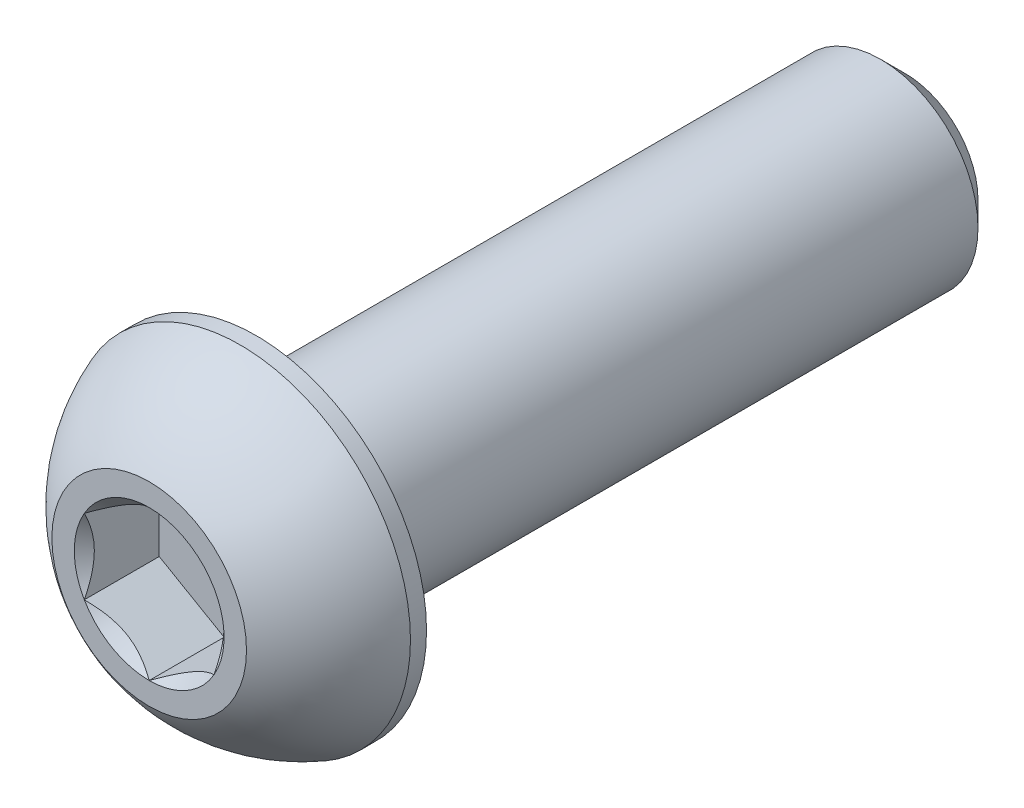
ISO-10303-21;
HEADER;
FILE_DESCRIPTION(('STEP AP214'),'2;1');
FILE_NAME('part.step','',(''),(''),'','','');
FILE_SCHEMA(('AUTOMOTIVE_DESIGN { 1 0 10303 214 1 1 1 1 }'));
ENDSEC;
DATA;
#1=APPLICATION_CONTEXT('core data for automotive mechanical design processes');
#2=APPLICATION_PROTOCOL_DEFINITION('international standard','automotive_design',2000,#1);
#3=PRODUCT_CONTEXT('',#1,'mechanical');
#4=PRODUCT('Part','Part','',(#3));
#5=PRODUCT_RELATED_PRODUCT_CATEGORY('part','',(#4));
#6=PRODUCT_DEFINITION_FORMATION('','',#4);
#7=PRODUCT_DEFINITION_CONTEXT('part definition',#1,'design');
#8=PRODUCT_DEFINITION('design','',#6,#7);
#9=PRODUCT_DEFINITION_SHAPE('','',#8);
#10=(LENGTH_UNIT() NAMED_UNIT(*) SI_UNIT(.MILLI.,.METRE.));
#11=(NAMED_UNIT(*) PLANE_ANGLE_UNIT() SI_UNIT($,.RADIAN.));
#12=(NAMED_UNIT(*) SI_UNIT($,.STERADIAN.) SOLID_ANGLE_UNIT());
#13=UNCERTAINTY_MEASURE_WITH_UNIT(LENGTH_MEASURE(1.E-05),#10,'distance_accuracy_value','');
#14=(GEOMETRIC_REPRESENTATION_CONTEXT(3) GLOBAL_UNCERTAINTY_ASSIGNED_CONTEXT((#13)) GLOBAL_UNIT_ASSIGNED_CONTEXT((#10,
#11,#12)) REPRESENTATION_CONTEXT('',''));
#15=CARTESIAN_POINT('',(0.,0.,0.));
#16=DIRECTION('',(0.,0.,1.));
#17=DIRECTION('',(1.,0.,0.));
#18=AXIS2_PLACEMENT_3D('',#15,#16,#17);
#19=CARTESIAN_POINT('',(0.,0.,-23.3));
#20=DIRECTION('',(0.,0.,1.));
#21=DIRECTION('',(1.,0.,0.));
#22=AXIS2_PLACEMENT_3D('',#19,#20,#21);
#23=PLANE('',#22);
#24=CARTESIAN_POINT('',(0.,0.,-23.3));
#25=DIRECTION('',(0.,0.,1.));
#26=DIRECTION('',(1.,0.,0.));
#27=AXIS2_PLACEMENT_3D('',#24,#25,#26);
#28=CIRCLE('',#27,2.25000000000002);
#29=CARTESIAN_POINT('',(2.25000000000002,0.,-23.3));
#30=VERTEX_POINT('',#29);
#31=EDGE_CURVE('E45',#30,#30,#28,.T.);
#32=ORIENTED_EDGE('',*,*,#31,.F.);
#33=EDGE_LOOP('',(#32));
#34=FACE_BOUND('',#33,.T.);
#35=ADVANCED_FACE('F42',(#34),#23,.F.);
#36=CARTESIAN_POINT('',(0.,0.,-23.3));
#37=DIRECTION('',(0.,0.,1.));
#38=DIRECTION('',(1.,0.,0.));
#39=AXIS2_PLACEMENT_3D('',#36,#37,#38);
#40=CONICAL_SURFACE('',#39,2.25000000000002,0.785398163397447);
#41=CARTESIAN_POINT('',(0.,0.,-22.55));
#42=DIRECTION('',(0.,0.,1.));
#43=DIRECTION('',(1.,0.,0.));
#44=AXIS2_PLACEMENT_3D('',#41,#42,#43);
#45=CIRCLE('',#44,3.00000000000002);
#46=CARTESIAN_POINT('',(3.00000000000002,0.,-22.55));
#47=VERTEX_POINT('',#46);
#48=EDGE_CURVE('E138',#47,#47,#45,.T.);
#49=ORIENTED_EDGE('',*,*,#48,.F.);
#50=EDGE_LOOP('',(#49));
#51=FACE_BOUND('',#50,.T.);
#52=ORIENTED_EDGE('',*,*,#31,.T.);
#53=EDGE_LOOP('',(#52));
#54=FACE_BOUND('',#53,.T.);
#55=ADVANCED_FACE('F159',(#51,#54),#40,.T.);
#56=CARTESIAN_POINT('',(0.,0.,0.));
#57=DIRECTION('',(0.,0.,1.));
#58=DIRECTION('',(1.,0.,0.));
#59=AXIS2_PLACEMENT_3D('',#56,#57,#58);
#60=CYLINDRICAL_SURFACE('',#59,3.00000000000001);
#61=CARTESIAN_POINT('',(0.,0.,-3.3));
#62=DIRECTION('',(0.,0.,1.));
#63=DIRECTION('',(1.,0.,0.));
#64=AXIS2_PLACEMENT_3D('',#61,#62,#63);
#65=CIRCLE('',#64,3.00000000000001);
#66=CARTESIAN_POINT('',(3.00000000000001,0.,-3.3));
#67=VERTEX_POINT('',#66);
#68=EDGE_CURVE('E12',#67,#67,#65,.T.);
#69=ORIENTED_EDGE('',*,*,#68,.F.);
#70=EDGE_LOOP('',(#69));
#71=FACE_BOUND('',#70,.T.);
#72=ORIENTED_EDGE('',*,*,#48,.T.);
#73=EDGE_LOOP('',(#72));
#74=FACE_BOUND('',#73,.T.);
#75=ADVANCED_FACE('F166',(#71,#74),#60,.T.);
#76=CARTESIAN_POINT('',(5.25,0.,-3.3));
#77=DIRECTION('',(0.,0.,-1.));
#78=DIRECTION('',(-1.,0.,0.));
#79=AXIS2_PLACEMENT_3D('',#76,#77,#78);
#80=PLANE('',#79);
#81=ORIENTED_EDGE('',*,*,#68,.T.);
#82=EDGE_LOOP('',(#81));
#83=FACE_BOUND('',#82,.T.);
#84=CARTESIAN_POINT('',(0.,0.,-3.3));
#85=DIRECTION('',(0.,0.,1.));
#86=DIRECTION('',(1.,0.,0.));
#87=AXIS2_PLACEMENT_3D('',#84,#85,#86);
#88=CIRCLE('',#87,5.25);
#89=CARTESIAN_POINT('',(5.25,0.,-3.3));
#90=VERTEX_POINT('',#89);
#91=EDGE_CURVE('E260',#90,#90,#88,.T.);
#92=ORIENTED_EDGE('',*,*,#91,.F.);
#93=EDGE_LOOP('',(#92));
#94=FACE_BOUND('',#93,.T.);
#95=ADVANCED_FACE('F169',(#83,#94),#80,.T.);
#96=CARTESIAN_POINT('',(2.,-1.15470053837925,-2.31));
#97=DIRECTION('',(0.,0.,1.));
#98=DIRECTION('',(1.,0.,0.));
#99=AXIS2_PLACEMENT_3D('',#96,#97,#98);
#100=PLANE('',#99);
#101=DIRECTION('',(0.866025403784438,0.5,0.));
#102=VECTOR('',#101,1.);
#103=CARTESIAN_POINT('',(0.,-2.3094010767585,-2.31));
#104=LINE('',#103,#102);
#105=CARTESIAN_POINT('',(0.,-2.3094010767585,-2.31));
#106=VERTEX_POINT('',#105);
#107=CARTESIAN_POINT('',(2.,-1.15470053837925,-2.31));
#108=VERTEX_POINT('',#107);
#109=EDGE_CURVE('E113',#106,#108,#104,.T.);
#110=ORIENTED_EDGE('',*,*,#109,.T.);
#111=DIRECTION('',(0.,1.,0.));
#112=VECTOR('',#111,1.);
#113=CARTESIAN_POINT('',(2.,-1.15470053837925,-2.31));
#114=LINE('',#113,#112);
#115=CARTESIAN_POINT('',(2.,1.15470053837925,-2.31));
#116=VERTEX_POINT('',#115);
#117=EDGE_CURVE('E296',#108,#116,#114,.T.);
#118=ORIENTED_EDGE('',*,*,#117,.T.);
#119=DIRECTION('',(-0.866025403784439,0.5,0.));
#120=VECTOR('',#119,1.);
#121=CARTESIAN_POINT('',(2.,1.15470053837925,-2.31));
#122=LINE('',#121,#120);
#123=CARTESIAN_POINT('',(0.,2.3094010767585,-2.31));
#124=VERTEX_POINT('',#123);
#125=EDGE_CURVE('E292',#116,#124,#122,.T.);
#126=ORIENTED_EDGE('',*,*,#125,.T.);
#127=DIRECTION('',(-0.866025403784438,-0.5,0.));
#128=VECTOR('',#127,1.);
#129=CARTESIAN_POINT('',(0.,2.3094010767585,-2.31));
#130=LINE('',#129,#128);
#131=CARTESIAN_POINT('',(-2.,1.15470053837925,-2.31));
#132=VERTEX_POINT('',#131);
#133=EDGE_CURVE('E288',#124,#132,#130,.T.);
#134=ORIENTED_EDGE('',*,*,#133,.T.);
#135=DIRECTION('',(0.,-1.,0.));
#136=VECTOR('',#135,1.);
#137=CARTESIAN_POINT('',(-2.,1.15470053837925,-2.31));
#138=LINE('',#137,#136);
#139=CARTESIAN_POINT('',(-2.,-1.15470053837925,-2.31));
#140=VERTEX_POINT('',#139);
#141=EDGE_CURVE('E284',#132,#140,#138,.T.);
#142=ORIENTED_EDGE('',*,*,#141,.T.);
#143=DIRECTION('',(0.866025403784439,-0.5,0.));
#144=VECTOR('',#143,1.);
#145=CARTESIAN_POINT('',(-2.,-1.15470053837925,-2.31));
#146=LINE('',#145,#144);
#147=EDGE_CURVE('E268',#140,#106,#146,.T.);
#148=ORIENTED_EDGE('',*,*,#147,.T.);
#149=EDGE_LOOP('',(#110,#118,#126,#134,#142,#148));
#150=FACE_BOUND('',#149,.T.);
#151=ADVANCED_FACE('F162',(#150),#100,.T.);
#152=CARTESIAN_POINT('',(-2.,-1.15470053837925,-2.31));
#153=DIRECTION('',(-0.5,-0.866025403784439,0.));
#154=DIRECTION('',(0.866025403784439,-0.5,0.));
#155=AXIS2_PLACEMENT_3D('',#152,#153,#154);
#156=PLANE('',#155);
#157=DIRECTION('',(0.,0.,1.));
#158=VECTOR('',#157,1.);
#159=CARTESIAN_POINT('',(-2.,-1.15470053837925,-2.31));
#160=LINE('',#159,#158);
#161=CARTESIAN_POINT('',(-2.,-1.15470053837925,0.));
#162=VERTEX_POINT('',#161);
#163=EDGE_CURVE('E120',#140,#162,#160,.T.);
#164=ORIENTED_EDGE('',*,*,#163,.T.);
#165=CARTESIAN_POINT('',(-2.0002,-1.15458506832541,0.000115478713658338));
#166=CARTESIAN_POINT('',(-1.93144696596929,-1.19427965103064,-0.0395469097744091));
#167=CARTESIAN_POINT('',(-1.86154425786449,-1.23463799837204,-0.0768800177158392));
#168=CARTESIAN_POINT('',(-1.71900475544956,-1.31693321846145,-0.145236314863858));
#169=CARTESIAN_POINT('',(-1.64635440243464,-1.35887791933134,-0.17622146626278));
#170=CARTESIAN_POINT('',(-1.49985839894603,-1.44345742638069,-0.229299783455858));
#171=CARTESIAN_POINT('',(-1.4260500647537,-1.48607068799507,-0.25152637282339));
#172=CARTESIAN_POINT('',(-1.27680836816474,-1.57223542169503,-0.28577118332492));
#173=CARTESIAN_POINT('',(-1.20137956608185,-1.61578426088223,-0.297814970855866));
#174=CARTESIAN_POINT('',(-1.07138449932892,-1.69083694766536,-0.308681488094429));
#175=CARTESIAN_POINT('',(-1.01698621602989,-1.72224381117151,-0.31029024639003));
#176=CARTESIAN_POINT('',(-0.908278544480306,-1.78500621460364,-0.307581122401289));
#177=CARTESIAN_POINT('',(-0.853969194078661,-1.81636173267754,-0.303261162242026));
#178=CARTESIAN_POINT('',(-0.745863272410662,-1.87877671565355,-0.288940432590095));
#179=CARTESIAN_POINT('',(-0.692067343445207,-1.90983580972306,-0.278933307237994));
#180=CARTESIAN_POINT('',(-0.585405737694426,-1.97141691651547,-0.253787569750341));
#181=CARTESIAN_POINT('',(-0.532539989929287,-2.00193897021859,-0.238649350957761));
#182=CARTESIAN_POINT('',(-0.397120266910156,-2.08012358375727,-0.193705496570811));
#183=CARTESIAN_POINT('',(-0.315406165150521,-2.12730124240478,-0.160511160574185));
#184=CARTESIAN_POINT('',(-0.195252962742198,-2.19667172615922,-0.104474176828631));
#185=CARTESIAN_POINT('',(-0.155657147890823,-2.21953238052245,-0.0847852970530609));
#186=CARTESIAN_POINT('',(-0.0771990411121285,-2.26483018959123,-0.0436126816351298));
#187=CARTESIAN_POINT('',(-0.0383363164062605,-2.28726759416161,-0.0221300483487543));
#188=CARTESIAN_POINT('',(0.000199999999999143,-2.30951654681234,0.00011547871365829));
#189=B_SPLINE_CURVE_WITH_KNOTS('',3,(#165,#166,#167,#168,#169,#170,#171,#172,#173,#174,#175,
#176,#177,#178,#179,#180,#181,#182,#183,#184,#185,#186,#187,#188),.UNSPECIFIED.,.F.,.F.,(4,2,2,
2,2,2,2,2,2,2,2,4),(0.,0.266420613771063,0.534393751523388,0.798110374376913,1.06116288956936,
1.24939906803721,1.43770123566247,1.62621426093931,1.81471283831913,2.11415604834144,
2.2634717071779,2.4126962696977),.UNSPECIFIED.);
#190=CARTESIAN_POINT('',(0.,-2.3094010767585,0.));
#191=VERTEX_POINT('',#190);
#192=EDGE_CURVE('E102',#162,#191,#189,.T.);
#193=ORIENTED_EDGE('',*,*,#192,.T.);
#194=DIRECTION('',(0.,0.,1.));
#195=VECTOR('',#194,1.);
#196=CARTESIAN_POINT('',(0.,-2.3094010767585,-2.31));
#197=LINE('',#196,#195);
#198=EDGE_CURVE('E119',#106,#191,#197,.T.);
#199=ORIENTED_EDGE('',*,*,#198,.F.);
#200=ORIENTED_EDGE('',*,*,#147,.F.);
#201=EDGE_LOOP('',(#164,#193,#199,#200));
#202=FACE_BOUND('',#201,.T.);
#203=ADVANCED_FACE('F117',(#202),#156,.F.);
#204=CARTESIAN_POINT('',(0.,-2.3094010767585,-2.31));
#205=DIRECTION('',(0.5,-0.866025403784438,0.));
#206=DIRECTION('',(0.866025403784438,0.5,0.));
#207=AXIS2_PLACEMENT_3D('',#204,#205,#206);
#208=PLANE('',#207);
#209=ORIENTED_EDGE('',*,*,#198,.T.);
#210=CARTESIAN_POINT('',(-0.000200000000000835,-2.30951654681234,0.000115478713658207));
#211=CARTESIAN_POINT('',(0.0685530340307047,-2.26982196410711,-0.0395469097744095));
#212=CARTESIAN_POINT('',(0.138455742135511,-2.22946361676571,-0.0768800177158398));
#213=CARTESIAN_POINT('',(0.280995244550436,-2.1471683966763,-0.145236314863859));
#214=CARTESIAN_POINT('',(0.353645597565358,-2.10522369580642,-0.176221466262781));
#215=CARTESIAN_POINT('',(0.500141601053971,-2.02064418875706,-0.229299783455859));
#216=CARTESIAN_POINT('',(0.573949935246294,-1.97803092714268,-0.251526372823391));
#217=CARTESIAN_POINT('',(0.723191631835264,-1.89186619344273,-0.285771183324922));
#218=CARTESIAN_POINT('',(0.798620433918151,-1.84831735425552,-0.297814970855867));
#219=CARTESIAN_POINT('',(0.928615500671079,-1.77326466747239,-0.30868148809443));
#220=CARTESIAN_POINT('',(0.983013783970108,-1.74185780396625,-0.310290246390032));
#221=CARTESIAN_POINT('',(1.09172145551969,-1.67909540053412,-0.307581122401291));
#222=CARTESIAN_POINT('',(1.14603080592134,-1.64773988246021,-0.303261162242028));
#223=CARTESIAN_POINT('',(1.25413672758934,-1.5853248994842,-0.288940432590096));
#224=CARTESIAN_POINT('',(1.30793265655479,-1.55426580541469,-0.278933307237996));
#225=CARTESIAN_POINT('',(1.41459426230557,-1.49268469862228,-0.253787569750343));
#226=CARTESIAN_POINT('',(1.46746001007071,-1.46216264491916,-0.238649350957762));
#227=CARTESIAN_POINT('',(1.60287973308984,-1.38397803138048,-0.193705496570812));
#228=CARTESIAN_POINT('',(1.68459383484948,-1.33680037273297,-0.160511160574186));
#229=CARTESIAN_POINT('',(1.8047470372578,-1.26742988897853,-0.104474176828632));
#230=CARTESIAN_POINT('',(1.84434285210918,-1.2445692346153,-0.0847852970530614));
#231=CARTESIAN_POINT('',(1.92280095888787,-1.19927142554652,-0.0436126816351297));
#232=CARTESIAN_POINT('',(1.96166368359374,-1.17683402097614,-0.0221300483487541));
#233=CARTESIAN_POINT('',(2.0002,-1.15458506832541,0.000115478713658316));
#234=B_SPLINE_CURVE_WITH_KNOTS('',3,(#210,#211,#212,#213,#214,#215,#216,#217,#218,#219,#220,
#221,#222,#223,#224,#225,#226,#227,#228,#229,#230,#231,#232,#233),.UNSPECIFIED.,.F.,.F.,(4,2,2,
2,2,2,2,2,2,2,2,4),(0.,0.266420613771064,0.534393751523389,0.798110374376915,1.06116288956936,
1.24939906803722,1.43770123566247,1.62621426093932,1.81471283831913,2.11415604834145,
2.26347170717791,2.41269626969771),.UNSPECIFIED.);
#235=CARTESIAN_POINT('',(2.,-1.15470053837925,0.));
#236=VERTEX_POINT('',#235);
#237=EDGE_CURVE('E109',#191,#236,#234,.T.);
#238=ORIENTED_EDGE('',*,*,#237,.T.);
#239=DIRECTION('',(0.,0.,1.));
#240=VECTOR('',#239,1.);
#241=CARTESIAN_POINT('',(2.,-1.15470053837925,-2.31));
#242=LINE('',#241,#240);
#243=EDGE_CURVE('E65',#108,#236,#242,.T.);
#244=ORIENTED_EDGE('',*,*,#243,.F.);
#245=ORIENTED_EDGE('',*,*,#109,.F.);
#246=EDGE_LOOP('',(#209,#238,#244,#245));
#247=FACE_BOUND('',#246,.T.);
#248=ADVANCED_FACE('F124',(#247),#208,.F.);
#249=CARTESIAN_POINT('',(2.,-1.15470053837925,-2.31));
#250=DIRECTION('',(1.,0.,0.));
#251=DIRECTION('',(0.,0.,-1.));
#252=AXIS2_PLACEMENT_3D('',#249,#250,#251);
#253=PLANE('',#252);
#254=ORIENTED_EDGE('',*,*,#243,.T.);
#255=CARTESIAN_POINT('',(2.,-2.30294417292923,0.740771355027718));
#256=CARTESIAN_POINT('',(2.,-2.24687002663711,0.698443273625961));
#257=CARTESIAN_POINT('',(2.,-2.19048190536959,0.656525156864335));
#258=CARTESIAN_POINT('',(2.,-2.07695390496424,0.573690417861015));
#259=CARTESIAN_POINT('',(2.,-2.01981384066453,0.532774049668071));
#260=CARTESIAN_POINT('',(2.,-1.90424016804775,0.451833452018561));
#261=CARTESIAN_POINT('',(2.,-1.84579996743909,0.411818591559866));
#262=CARTESIAN_POINT('',(2.,-1.7279274546176,0.333288993664291));
#263=CARTESIAN_POINT('',(2.,-1.66849521292323,0.29477415024314));
#264=CARTESIAN_POINT('',(2.,-1.48162995710019,0.177640651604293));
#265=CARTESIAN_POINT('',(2.,-1.35220318163536,0.102145901729643));
#266=CARTESIAN_POINT('',(2.,-1.08689521592924,-0.03595064900562));
#267=CARTESIAN_POINT('',(2.,-0.951037763938188,-0.098595914096505));
#268=CARTESIAN_POINT('',(2.,-0.747111912259406,-0.175236456124857));
#269=CARTESIAN_POINT('',(2.,-0.682064034147873,-0.197232820080877));
#270=CARTESIAN_POINT('',(2.,-0.550398103294749,-0.23600331233986));
#271=CARTESIAN_POINT('',(2.,-0.483779942722473,-0.252777080878817));
#272=CARTESIAN_POINT('',(2.,-0.350484328847652,-0.279951742115554));
#273=CARTESIAN_POINT('',(2.,-0.283829489364783,-0.290461823258314));
#274=CARTESIAN_POINT('',(2.,-0.149806987139375,-0.304903914455084));
#275=CARTESIAN_POINT('',(2.,-0.0824394489341202,-0.308837055266886));
#276=CARTESIAN_POINT('',(2.,0.0499055622944913,-0.309833523066282));
#277=CARTESIAN_POINT('',(2.,0.114881285143174,-0.30714035514959));
#278=CARTESIAN_POINT('',(2.,0.244275921482762,-0.295569929577307));
#279=CARTESIAN_POINT('',(2.,0.308694780266755,-0.286692071166775));
#280=CARTESIAN_POINT('',(2.,0.437599788610706,-0.263086340703851));
#281=CARTESIAN_POINT('',(2.,0.502067428644596,-0.248258916553487));
#282=CARTESIAN_POINT('',(2.,0.629594322598307,-0.213542116372029));
#283=CARTESIAN_POINT('',(2.,0.692653693883151,-0.193653163893723));
#284=CARTESIAN_POINT('',(2.,0.891187889210545,-0.1235530207438));
#285=CARTESIAN_POINT('',(2.,1.02383545707306,-0.0653581996784902));
#286=CARTESIAN_POINT('',(2.,1.28290932150074,0.0640305754595774));
#287=CARTESIAN_POINT('',(2.,1.4093111258757,0.135271231414843));
#288=CARTESIAN_POINT('',(2.,1.59200441438963,0.246441991874722));
#289=CARTESIAN_POINT('',(2.,1.65027549026191,0.283182190337376));
#290=CARTESIAN_POINT('',(2.,1.76581760389243,0.358214514183767));
#291=CARTESIAN_POINT('',(2.,1.82308856543105,0.39650675711804));
#292=CARTESIAN_POINT('',(2.,1.93629654762084,0.474042264081227));
#293=CARTESIAN_POINT('',(2.,1.99224062500539,0.513275276133586));
#294=CARTESIAN_POINT('',(2.,2.103364240299,0.592778830736517));
#295=CARTESIAN_POINT('',(2.,2.15854398422468,0.633049085000598));
#296=CARTESIAN_POINT('',(2.,2.21340370692659,0.673744238145943));
#297=B_SPLINE_CURVE_WITH_KNOTS('',3,(#255,#256,#257,#258,#259,#260,#261,#262,#263,#264,#265,
#266,#267,#268,#269,#270,#271,#272,#273,#274,#275,#276,#277,#278,#279,#280,#281,#282,#283,#284,
#285,#286,#287,#288,#289,#290,#291,#292,#293,#294,#295,#296),.UNSPECIFIED.,.F.,.F.,(4,2,2,2,2,2,
2,2,2,2,2,2,2,2,2,2,2,2,2,2,4),(0.,0.210772731976891,0.421598374658589,0.634057554623487,
0.846501695870169,1.29562155455624,1.74319622821645,1.94902062110207,2.15485918928325,
2.35699582502635,2.55909770432139,2.75388435553556,2.94868993014814,3.14690093452585,
3.34509535789701,3.77838155837653,4.21325029921624,4.41989056685646,4.6265465146092,
4.83152377111289,5.03644465914084),.UNSPECIFIED.);
#298=CARTESIAN_POINT('',(2.,1.15470053837925,0.));
#299=VERTEX_POINT('',#298);
#300=EDGE_CURVE('E189',#236,#299,#297,.T.);
#301=ORIENTED_EDGE('',*,*,#300,.T.);
#302=DIRECTION('',(0.,0.,1.));
#303=VECTOR('',#302,1.);
#304=CARTESIAN_POINT('',(2.,1.15470053837925,-2.31));
#305=LINE('',#304,#303);
#306=EDGE_CURVE('E269',#116,#299,#305,.T.);
#307=ORIENTED_EDGE('',*,*,#306,.F.);
#308=ORIENTED_EDGE('',*,*,#117,.F.);
#309=EDGE_LOOP('',(#254,#301,#307,#308));
#310=FACE_BOUND('',#309,.T.);
#311=ADVANCED_FACE('F234',(#310),#253,.F.);
#312=CARTESIAN_POINT('',(2.,1.15470053837925,-2.31));
#313=DIRECTION('',(0.5,0.866025403784439,0.));
#314=DIRECTION('',(-0.866025403784439,0.5,0.));
#315=AXIS2_PLACEMENT_3D('',#312,#313,#314);
#316=PLANE('',#315);
#317=ORIENTED_EDGE('',*,*,#306,.T.);
#318=CARTESIAN_POINT('',(2.0002,1.15458506832541,0.000115478713659639));
#319=CARTESIAN_POINT('',(1.93144696596929,1.19427965103064,-0.0395469097744081));
#320=CARTESIAN_POINT('',(1.86154425786449,1.23463799837204,-0.0768800177158384));
#321=CARTESIAN_POINT('',(1.71900475544956,1.31693321846145,-0.145236314863857));
#322=CARTESIAN_POINT('',(1.64635440243464,1.35887791933134,-0.176221466262779));
#323=CARTESIAN_POINT('',(1.49985839894603,1.44345742638069,-0.229299783455857));
#324=CARTESIAN_POINT('',(1.42605006475371,1.48607068799507,-0.251526372823389));
#325=CARTESIAN_POINT('',(1.27680836816474,1.57223542169503,-0.285771183324919));
#326=CARTESIAN_POINT('',(1.20137956608185,1.61578426088223,-0.297814970855865));
#327=CARTESIAN_POINT('',(1.07138449932892,1.69083694766536,-0.308681488094428));
#328=CARTESIAN_POINT('',(1.01698621602989,1.72224381117151,-0.31029024639003));
#329=CARTESIAN_POINT('',(0.908278544480306,1.78500621460364,-0.307581122401289));
#330=CARTESIAN_POINT('',(0.853969194078661,1.81636173267754,-0.303261162242026));
#331=CARTESIAN_POINT('',(0.745863272410662,1.87877671565355,-0.288940432590094));
#332=CARTESIAN_POINT('',(0.692067343445208,1.90983580972306,-0.278933307237994));
#333=CARTESIAN_POINT('',(0.585405737694426,1.97141691651547,-0.253787569750341));
#334=CARTESIAN_POINT('',(0.532539989929287,2.00193897021859,-0.23864935095776));
#335=CARTESIAN_POINT('',(0.397120266910156,2.08012358375727,-0.19370549657081));
#336=CARTESIAN_POINT('',(0.315406165150521,2.12730124240478,-0.160511160574184));
#337=CARTESIAN_POINT('',(0.195252962742198,2.19667172615922,-0.104474176828631));
#338=CARTESIAN_POINT('',(0.155657147890823,2.21953238052245,-0.0847852970530605));
#339=CARTESIAN_POINT('',(0.0771990411121279,2.26483018959123,-0.0436126816351292));
#340=CARTESIAN_POINT('',(0.0383363164062598,2.28726759416161,-0.0221300483487536));
#341=CARTESIAN_POINT('',(-0.000199999999999718,2.30951654681234,0.000115478713658957));
#342=B_SPLINE_CURVE_WITH_KNOTS('',3,(#318,#319,#320,#321,#322,#323,#324,#325,#326,#327,#328,
#329,#330,#331,#332,#333,#334,#335,#336,#337,#338,#339,#340,#341),.UNSPECIFIED.,.F.,.F.,(4,2,2,
2,2,2,2,2,2,2,2,4),(0.,0.266420613771064,0.534393751523389,0.798110374376915,1.06116288956936,
1.24939906803722,1.43770123566247,1.62621426093932,1.81471283831913,2.11415604834145,
2.2634717071779,2.41269626969771),.UNSPECIFIED.);
#343=CARTESIAN_POINT('',(0.,2.3094010767585,0.));
#344=VERTEX_POINT('',#343);
#345=EDGE_CURVE('E143',#299,#344,#342,.T.);
#346=ORIENTED_EDGE('',*,*,#345,.T.);
#347=DIRECTION('',(0.,0.,1.));
#348=VECTOR('',#347,1.);
#349=CARTESIAN_POINT('',(0.,2.3094010767585,-2.31));
#350=LINE('',#349,#348);
#351=EDGE_CURVE('E273',#124,#344,#350,.T.);
#352=ORIENTED_EDGE('',*,*,#351,.F.);
#353=ORIENTED_EDGE('',*,*,#125,.F.);
#354=EDGE_LOOP('',(#317,#346,#352,#353));
#355=FACE_BOUND('',#354,.T.);
#356=ADVANCED_FACE('F230',(#355),#316,.F.);
#357=CARTESIAN_POINT('',(0.,2.3094010767585,-2.31));
#358=DIRECTION('',(-0.5,0.866025403784439,0.));
#359=DIRECTION('',(-0.866025403784439,-0.5,0.));
#360=AXIS2_PLACEMENT_3D('',#357,#358,#359);
#361=PLANE('',#360);
#362=ORIENTED_EDGE('',*,*,#351,.T.);
#363=CARTESIAN_POINT('',(0.000200000000000074,2.30951654681234,0.000115478713659074));
#364=CARTESIAN_POINT('',(-0.0685530340307055,2.26982196410711,-0.0395469097744085));
#365=CARTESIAN_POINT('',(-0.138455742135512,2.22946361676572,-0.0768800177158388));
#366=CARTESIAN_POINT('',(-0.280995244550437,2.1471683966763,-0.145236314863858));
#367=CARTESIAN_POINT('',(-0.353645597565359,2.10522369580642,-0.17622146626278));
#368=CARTESIAN_POINT('',(-0.500141601053972,2.02064418875706,-0.229299783455858));
#369=CARTESIAN_POINT('',(-0.573949935246295,1.97803092714269,-0.25152637282339));
#370=CARTESIAN_POINT('',(-0.723191631835265,1.89186619344273,-0.28577118332492));
#371=CARTESIAN_POINT('',(-0.798620433918153,1.84831735425552,-0.297814970855866));
#372=CARTESIAN_POINT('',(-0.92861550067108,1.77326466747239,-0.308681488094429));
#373=CARTESIAN_POINT('',(-0.983013783970109,1.74185780396625,-0.31029024639003));
#374=CARTESIAN_POINT('',(-1.09172145551969,1.67909540053412,-0.307581122401289));
#375=CARTESIAN_POINT('',(-1.14603080592134,1.64773988246021,-0.303261162242026));
#376=CARTESIAN_POINT('',(-1.25413672758934,1.5853248994842,-0.288940432590095));
#377=CARTESIAN_POINT('',(-1.30793265655479,1.55426580541469,-0.278933307237994));
#378=CARTESIAN_POINT('',(-1.41459426230557,1.49268469862228,-0.253787569750341));
#379=CARTESIAN_POINT('',(-1.46746001007071,1.46216264491916,-0.238649350957761));
#380=CARTESIAN_POINT('',(-1.60287973308984,1.38397803138048,-0.19370549657081));
#381=CARTESIAN_POINT('',(-1.68459383484948,1.33680037273297,-0.160511160574185));
#382=CARTESIAN_POINT('',(-1.8047470372578,1.26742988897853,-0.104474176828631));
#383=CARTESIAN_POINT('',(-1.84434285210918,1.24456923461531,-0.0847852970530604));
#384=CARTESIAN_POINT('',(-1.92280095888787,1.19927142554652,-0.0436126816351291));
#385=CARTESIAN_POINT('',(-1.96166368359374,1.17683402097614,-0.0221300483487537));
#386=CARTESIAN_POINT('',(-2.0002,1.15458506832541,0.000115478713658604));
#387=B_SPLINE_CURVE_WITH_KNOTS('',3,(#363,#364,#365,#366,#367,#368,#369,#370,#371,#372,#373,
#374,#375,#376,#377,#378,#379,#380,#381,#382,#383,#384,#385,#386),.UNSPECIFIED.,.F.,.F.,(4,2,2,
2,2,2,2,2,2,2,2,4),(0.,0.266420613771064,0.534393751523389,0.798110374376915,1.06116288956936,
1.24939906803722,1.43770123566247,1.62621426093932,1.81471283831913,2.11415604834145,
2.26347170717791,2.41269626969771),.UNSPECIFIED.);
#388=CARTESIAN_POINT('',(-2.,1.15470053837925,0.));
#389=VERTEX_POINT('',#388);
#390=EDGE_CURVE('E199',#344,#389,#387,.T.);
#391=ORIENTED_EDGE('',*,*,#390,.T.);
#392=DIRECTION('',(0.,0.,1.));
#393=VECTOR('',#392,1.);
#394=CARTESIAN_POINT('',(-2.,1.15470053837925,-2.31));
#395=LINE('',#394,#393);
#396=EDGE_CURVE('E277',#132,#389,#395,.T.);
#397=ORIENTED_EDGE('',*,*,#396,.F.);
#398=ORIENTED_EDGE('',*,*,#133,.F.);
#399=EDGE_LOOP('',(#362,#391,#397,#398));
#400=FACE_BOUND('',#399,.T.);
#401=ADVANCED_FACE('F226',(#400),#361,.F.);
#402=CARTESIAN_POINT('',(-2.,1.15470053837925,-2.31));
#403=DIRECTION('',(-1.,0.,0.));
#404=DIRECTION('',(0.,-1.,0.));
#405=AXIS2_PLACEMENT_3D('',#402,#403,#404);
#406=PLANE('',#405);
#407=ORIENTED_EDGE('',*,*,#396,.T.);
#408=CARTESIAN_POINT('',(-2.,-2.30294417292923,0.740771355027722));
#409=CARTESIAN_POINT('',(-2.,-2.24687002663712,0.698443273625964));
#410=CARTESIAN_POINT('',(-2.,-2.19048190536959,0.656525156864338));
#411=CARTESIAN_POINT('',(-2.,-2.07695390496424,0.573690417861018));
#412=CARTESIAN_POINT('',(-2.,-2.01981384066454,0.532774049668074));
#413=CARTESIAN_POINT('',(-2.,-1.90424016804776,0.451833452018564));
#414=CARTESIAN_POINT('',(-2.,-1.8457999674391,0.411818591559868));
#415=CARTESIAN_POINT('',(-2.,-1.7279274546176,0.333288993664293));
#416=CARTESIAN_POINT('',(-2.,-1.66849521292324,0.294774150243142));
#417=CARTESIAN_POINT('',(-2.,-1.4816299571002,0.177640651604295));
#418=CARTESIAN_POINT('',(-2.,-1.35220318163536,0.102145901729644));
#419=CARTESIAN_POINT('',(-2.,-1.08689521592924,-0.0359506490056196));
#420=CARTESIAN_POINT('',(-2.,-0.951037763938192,-0.0985959140965052));
#421=CARTESIAN_POINT('',(-2.,-0.747111912259409,-0.175236456124857));
#422=CARTESIAN_POINT('',(-2.,-0.682064034147875,-0.197232820080877));
#423=CARTESIAN_POINT('',(-2.,-0.550398103294752,-0.236003312339861));
#424=CARTESIAN_POINT('',(-2.,-0.483779942722475,-0.252777080878818));
#425=CARTESIAN_POINT('',(-2.,-0.350484328847654,-0.279951742115556));
#426=CARTESIAN_POINT('',(-2.,-0.283829489364785,-0.290461823258315));
#427=CARTESIAN_POINT('',(-2.,-0.149806987139377,-0.304903914455085));
#428=CARTESIAN_POINT('',(-2.,-0.0824394489341218,-0.308837055266887));
#429=CARTESIAN_POINT('',(-2.,0.0499055622944896,-0.309833523066283));
#430=CARTESIAN_POINT('',(-2.,0.114881285143172,-0.307140355149592));
#431=CARTESIAN_POINT('',(-2.,0.24427592148276,-0.295569929577308));
#432=CARTESIAN_POINT('',(-2.,0.308694780266753,-0.286692071166777));
#433=CARTESIAN_POINT('',(-2.,0.437599788610704,-0.263086340703853));
#434=CARTESIAN_POINT('',(-2.,0.502067428644595,-0.248258916553489));
#435=CARTESIAN_POINT('',(-2.,0.629594322598306,-0.213542116372031));
#436=CARTESIAN_POINT('',(-2.,0.69265369388315,-0.193653163893725));
#437=CARTESIAN_POINT('',(-2.,0.891187889210544,-0.123553020743802));
#438=CARTESIAN_POINT('',(-2.,1.02383545707306,-0.0653581996784924));
#439=CARTESIAN_POINT('',(-2.,1.28290932150074,0.0640305754595753));
#440=CARTESIAN_POINT('',(-2.,1.4093111258757,0.13527123141484));
#441=CARTESIAN_POINT('',(-2.,1.59200441438963,0.246441991874719));
#442=CARTESIAN_POINT('',(-2.,1.65027549026191,0.283182190337373));
#443=CARTESIAN_POINT('',(-2.,1.76581760389242,0.358214514183764));
#444=CARTESIAN_POINT('',(-2.,1.82308856543104,0.396506757118038));
#445=CARTESIAN_POINT('',(-2.,1.93629654762084,0.474042264081224));
#446=CARTESIAN_POINT('',(-2.,1.99224062500538,0.513275276133584));
#447=CARTESIAN_POINT('',(-2.,2.10336424029899,0.592778830736514));
#448=CARTESIAN_POINT('',(-2.,2.15854398422468,0.633049085000596));
#449=CARTESIAN_POINT('',(-2.,2.21340370692658,0.67374423814594));
#450=B_SPLINE_CURVE_WITH_KNOTS('',3,(#408,#409,#410,#411,#412,#413,#414,#415,#416,#417,#418,
#419,#420,#421,#422,#423,#424,#425,#426,#427,#428,#429,#430,#431,#432,#433,#434,#435,#436,#437,
#438,#439,#440,#441,#442,#443,#444,#445,#446,#447,#448,#449),.UNSPECIFIED.,.F.,.F.,(4,2,2,2,2,2,
2,2,2,2,2,2,2,2,2,2,2,2,2,2,4),(0.,0.210772731976891,0.42159837465859,0.634057554623488,
0.846501695870171,1.29562155455624,1.74319622821645,1.94902062110207,2.15485918928326,
2.35699582502635,2.5590977043214,2.75388435553556,2.94868993014815,3.14690093452586,
3.34509535789702,3.77838155837654,4.21325029921625,4.41989056685647,4.62654651460921,
4.83152377111289,5.03644465914085),.UNSPECIFIED.);
#451=EDGE_CURVE('E122',#389,#162,#450,.F.);
#452=ORIENTED_EDGE('',*,*,#451,.T.);
#453=ORIENTED_EDGE('',*,*,#163,.F.);
#454=ORIENTED_EDGE('',*,*,#141,.F.);
#455=EDGE_LOOP('',(#407,#452,#453,#454));
#456=FACE_BOUND('',#455,.T.);
#457=ADVANCED_FACE('F223',(#456),#406,.F.);
#458=CARTESIAN_POINT('',(0.,0.,0.));
#459=DIRECTION('',(0.,0.,1.));
#460=DIRECTION('',(1.,0.,0.));
#461=AXIS2_PLACEMENT_3D('',#458,#459,#460);
#462=CONICAL_SURFACE('',#461,2.3094010767585,0.78539816339745);
#463=CARTESIAN_POINT('',(0.,0.,0.));
#464=DIRECTION('',(0.,0.,1.));
#465=DIRECTION('',(1.,0.,0.));
#466=AXIS2_PLACEMENT_3D('',#463,#464,#465);
#467=CIRCLE('',#466,2.3094010767585);
#468=EDGE_CURVE('E99',#162,#191,#467,.T.);
#469=ORIENTED_EDGE('',*,*,#468,.T.);
#470=ORIENTED_EDGE('',*,*,#192,.F.);
#471=EDGE_LOOP('',(#469,#470));
#472=FACE_BOUND('',#471,.T.);
#473=ADVANCED_FACE('F100',(#472),#462,.F.);
#474=EDGE_CURVE('E57',#191,#236,#467,.T.);
#475=ORIENTED_EDGE('',*,*,#474,.T.);
#476=ORIENTED_EDGE('',*,*,#237,.F.);
#477=EDGE_LOOP('',(#475,#476));
#478=FACE_BOUND('',#477,.T.);
#479=ADVANCED_FACE('F110',(#478),#462,.F.);
#480=EDGE_CURVE('E135',#236,#299,#467,.T.);
#481=ORIENTED_EDGE('',*,*,#480,.T.);
#482=ORIENTED_EDGE('',*,*,#300,.F.);
#483=EDGE_LOOP('',(#481,#482));
#484=FACE_BOUND('',#483,.T.);
#485=ADVANCED_FACE('F184',(#484),#462,.F.);
#486=EDGE_CURVE('E139',#299,#344,#467,.T.);
#487=ORIENTED_EDGE('',*,*,#486,.T.);
#488=ORIENTED_EDGE('',*,*,#345,.F.);
#489=EDGE_LOOP('',(#487,#488));
#490=FACE_BOUND('',#489,.T.);
#491=ADVANCED_FACE('F322',(#490),#462,.F.);
#492=EDGE_CURVE('E142',#344,#389,#467,.T.);
#493=ORIENTED_EDGE('',*,*,#492,.T.);
#494=ORIENTED_EDGE('',*,*,#390,.F.);
#495=EDGE_LOOP('',(#493,#494));
#496=FACE_BOUND('',#495,.T.);
#497=ADVANCED_FACE('F318',(#496),#462,.F.);
#498=EDGE_CURVE('E107',#389,#162,#467,.T.);
#499=ORIENTED_EDGE('',*,*,#498,.T.);
#500=ORIENTED_EDGE('',*,*,#451,.F.);
#501=EDGE_LOOP('',(#499,#500));
#502=FACE_BOUND('',#501,.T.);
#503=ADVANCED_FACE('F248',(#502),#462,.F.);
#504=CARTESIAN_POINT('',(0.,-3.00000000000001,0.));
#505=DIRECTION('',(0.,0.,-1.));
#506=DIRECTION('',(-1.,0.,0.));
#507=AXIS2_PLACEMENT_3D('',#504,#505,#506);
#508=PLANE('',#507);
#509=ORIENTED_EDGE('',*,*,#498,.F.);
#510=ORIENTED_EDGE('',*,*,#492,.F.);
#511=ORIENTED_EDGE('',*,*,#486,.F.);
#512=ORIENTED_EDGE('',*,*,#480,.F.);
#513=ORIENTED_EDGE('',*,*,#474,.F.);
#514=ORIENTED_EDGE('',*,*,#468,.F.);
#515=EDGE_LOOP('',(#509,#510,#511,#512,#513,#514));
#516=FACE_BOUND('',#515,.T.);
#517=CARTESIAN_POINT('',(0.,0.,0.));
#518=DIRECTION('',(0.,0.,1.));
#519=DIRECTION('',(1.,0.,0.));
#520=AXIS2_PLACEMENT_3D('',#517,#518,#519);
#521=CIRCLE('',#520,3.00000000000001);
#522=CARTESIAN_POINT('',(0.,-3.00000000000002,0.));
#523=VERTEX_POINT('',#522);
#524=EDGE_CURVE('E256',#523,#523,#521,.T.);
#525=ORIENTED_EDGE('',*,*,#524,.T.);
#526=EDGE_LOOP('',(#525));
#527=FACE_BOUND('',#526,.T.);
#528=ADVANCED_FACE('F131',(#516,#527),#508,.F.);
#529=CARTESIAN_POINT('',(0.,0.,-4.71132352941176));
#530=DIRECTION('',(0.,0.,1.));
#531=DIRECTION('',(0.,-1.,0.));
#532=AXIS2_PLACEMENT_3D('',#529,#530,#531);
#533=SPHERICAL_SURFACE('',#532,5.58538892099638);
#534=CARTESIAN_POINT('',(0.,0.,-2.805));
#535=DIRECTION('',(0.,0.,1.));
#536=DIRECTION('',(1.,0.,0.));
#537=AXIS2_PLACEMENT_3D('',#534,#535,#536);
#538=CIRCLE('',#537,5.25);
#539=CARTESIAN_POINT('',(0.,-5.25,-2.805));
#540=VERTEX_POINT('',#539);
#541=EDGE_CURVE('E128',#540,#540,#538,.T.);
#542=CARTESIAN_POINT('',(0.,-3.00000000000002,0.));
#543=CARTESIAN_POINT('',(0.,-3.03216841047473,-0.0204836076687069));
#544=CARTESIAN_POINT('',(0.,-3.06412696701747,-0.0412967747060147));
#545=CARTESIAN_POINT('',(0.,-3.12761110680186,-0.0835732798883759));
#546=CARTESIAN_POINT('',(0.,-3.15913669004351,-0.105036618033429));
#547=CARTESIAN_POINT('',(0.,-3.22174161778857,-0.148604517801824));
#548=CARTESIAN_POINT('',(0.,-3.25282096229197,-0.170709079425165));
#549=CARTESIAN_POINT('',(0.,-3.31452038302561,-0.215550136391723));
#550=CARTESIAN_POINT('',(0.,-3.34514045925584,-0.238286631734939));
#551=CARTESIAN_POINT('',(0.,-3.40590849355868,-0.284382020830629));
#552=CARTESIAN_POINT('',(0.,-3.43605645163128,-0.307740914583103));
#553=CARTESIAN_POINT('',(0.,-3.49586760131367,-0.355071298801886));
#554=CARTESIAN_POINT('',(0.,-3.52553079292346,-0.379042789268195));
#555=CARTESIAN_POINT('',(0.,-3.58435996382992,-0.427588309600938));
#556=CARTESIAN_POINT('',(0.,-3.61352594312658,-0.452162339467372));
#557=CARTESIAN_POINT('',(0.,-3.67134845242054,-0.501902628105114));
#558=CARTESIAN_POINT('',(0.,-3.70000498241783,-0.527068886876422));
#559=CARTESIAN_POINT('',(0.,-3.75679656980691,-0.577983074450793));
#560=CARTESIAN_POINT('',(0.,-3.78493162719869,-0.603731003253855));
#561=CARTESIAN_POINT('',(0.,-3.84066846488057,-0.655797727942871));
#562=CARTESIAN_POINT('',(0.,-3.86827024517067,-0.682116523828825));
#563=CARTESIAN_POINT('',(0.,-3.92292894789284,-0.735313940225866));
#564=CARTESIAN_POINT('',(0.,-3.94998587032492,-0.762192560736954));
#565=CARTESIAN_POINT('',(0.,-4.00354350517959,-0.816498349041453));
#566=CARTESIAN_POINT('',(0.,-4.03004421760218,-0.843925516834865));
#567=CARTESIAN_POINT('',(0.,-4.08247831365261,-0.899316892210196));
#568=CARTESIAN_POINT('',(0.,-4.10841169728045,-0.927281099792115));
#569=CARTESIAN_POINT('',(0.,-4.15970025498781,-0.983734821927127));
#570=CARTESIAN_POINT('',(0.,-4.18505542906732,-1.01222433648022));
#571=CARTESIAN_POINT('',(0.,-4.2351769295212,-1.06971671933959));
#572=CARTESIAN_POINT('',(0.,-4.25994325589557,-1.09871958764587));
#573=CARTESIAN_POINT('',(0.,-4.30887666984257,-1.15722650940808));
#574=CARTESIAN_POINT('',(0.,-4.33304375741519,-1.18673056286401));
#575=CARTESIAN_POINT('',(0.,-4.38076855408201,-1.24622747604199));
#576=CARTESIAN_POINT('',(0.,-4.40432626317622,-1.27622033576403));
#577=CARTESIAN_POINT('',(0.,-4.45082241888373,-1.33668227750444));
#578=CARTESIAN_POINT('',(0.,-4.47376086549703,-1.3671513595228));
#579=CARTESIAN_POINT('',(0.,-4.51900887206147,-1.4285529620796));
#580=CARTESIAN_POINT('',(0.,-4.54131843201259,-1.45948548261803));
#581=CARTESIAN_POINT('',(0.,-4.58529930493053,-1.52180098399588));
#582=CARTESIAN_POINT('',(0.,-4.60697061789735,-1.55318396483531));
#583=CARTESIAN_POINT('',(0.,-4.64966590431095,-1.61638721959847));
#584=CARTESIAN_POINT('',(0.,-4.67068987775773,-1.64820749352221));
#585=CARTESIAN_POINT('',(0.,-4.71208166419702,-1.71227198376418));
#586=CARTESIAN_POINT('',(0.,-4.73244947718953,-1.74451620008241));
#587=CARTESIAN_POINT('',(0.,-4.77252039708776,-1.80941504655214));
#588=CARTESIAN_POINT('',(0.,-4.79222350399348,-1.84206967670363));
#589=CARTESIAN_POINT('',(0.,-4.83095674497554,-1.90777565008234));
#590=CARTESIAN_POINT('',(0.,-4.84998687905189,-1.94082699330955));
#591=CARTESIAN_POINT('',(0.,-4.8873661899807,-2.00731252563814));
#592=CARTESIAN_POINT('',(0.,-4.90571536683316,-2.04074671473953));
#593=CARTESIAN_POINT('',(0.,-4.94172506465618,-2.10798391097428));
#594=CARTESIAN_POINT('',(0.,-4.95938558562673,-2.14178691810765));
#595=CARTESIAN_POINT('',(0.,-4.99401056185103,-2.20974756786458));
#596=CARTESIAN_POINT('',(0.,-5.01097501710478,-2.24390521048815));
#597=CARTESIAN_POINT('',(0.,-5.04420074452798,-2.31256079972767));
#598=CARTESIAN_POINT('',(0.,-5.06046201669743,-2.34705874634363));
#599=CARTESIAN_POINT('',(0.,-5.09227455404011,-2.41638046989934));
#600=CARTESIAN_POINT('',(0.,-5.10782581921333,-2.45120424683909));
#601=CARTESIAN_POINT('',(0.,-5.13821182242717,-2.52116301839372));
#602=CARTESIAN_POINT('',(0.,-5.15304656046779,-2.5562980130086));
#603=CARTESIAN_POINT('',(0.,-5.18199326796146,-2.62686448517116));
#604=CARTESIAN_POINT('',(0.,-5.19610523741451,-2.66229596271883));
#605=CARTESIAN_POINT('',(0.,-5.22360055144048,-2.7334405099534));
#606=CARTESIAN_POINT('',(0.,-5.23698389601341,-2.76915357964029));
#607=CARTESIAN_POINT('',(0.,-5.25,-2.805));
#608=B_SPLINE_CURVE_WITH_KNOTS('',3,(#542,#543,#544,#545,#546,#547,#548,#549,#550,#551,#552,
#553,#554,#555,#556,#557,#558,#559,#560,#561,#562,#563,#564,#565,#566,#567,#568,#569,#570,#571,
#572,#573,#574,#575,#576,#577,#578,#579,#580,#581,#582,#583,#584,#585,#586,#587,#588,#589,#590,
#591,#592,#593,#594,#595,#596,#597,#598,#599,#600,#601,#602,#603,#604,#605,#606,#607),
.UNSPECIFIED.,.F.,.F.,(4,2,2,2,2,2,2,2,2,2,2,2,2,2,2,2,2,2,2,2,2,2,2,2,2,2,2,2,2,2,2,2,4),(0.,
0.114407188898184,0.228814377796367,0.343221566694551,0.457628755592734,0.572035944490919,
0.686443133389102,0.800850322287285,0.915257511185469,1.02966470008365,1.14407188898184,
1.25847907788002,1.3728862667782,1.48729345567639,1.60170064457457,1.71610783347276,
1.83051502237094,1.94492221126912,2.05932940016731,2.17373658906549,2.28814377796367,
2.40255096686186,2.51695815576004,2.63136534465822,2.74577253355641,2.86017972245459,
2.97458691135278,3.08899410025096,3.20340128914914,3.31780847804733,3.43221566694551,
3.54662285584369,3.66103004474188),.UNSPECIFIED.);
#609=EDGE_CURVE('BSEAM244',#523,#540,#608,.T.);
#610=ORIENTED_EDGE('',*,*,#524,.F.);
#611=ORIENTED_EDGE('',*,*,#541,.T.);
#612=ORIENTED_EDGE('',*,*,#609,.T.);
#613=ORIENTED_EDGE('',*,*,#609,.F.);
#614=EDGE_LOOP('',(#610,#612,#611,#613));
#615=FACE_BOUND('',#614,.T.);
#616=ADVANCED_FACE('F244',(#615),#533,.T.);
#617=CARTESIAN_POINT('',(0.,0.,0.));
#618=DIRECTION('',(0.,0.,1.));
#619=DIRECTION('',(1.,0.,0.));
#620=AXIS2_PLACEMENT_3D('',#617,#618,#619);
#621=CYLINDRICAL_SURFACE('',#620,5.25);
#622=ORIENTED_EDGE('',*,*,#541,.F.);
#623=EDGE_LOOP('',(#622));
#624=FACE_BOUND('',#623,.T.);
#625=ORIENTED_EDGE('',*,*,#91,.T.);
#626=EDGE_LOOP('',(#625));
#627=FACE_BOUND('',#626,.T.);
#628=ADVANCED_FACE('F180',(#624,#627),#621,.T.);
#629=CLOSED_SHELL('',(#35,#55,#75,#95,#151,#203,#248,#311,#356,#401,#457,#473,#479,#485,#491,
#497,#503,#528,#616,#628));
#630=MANIFOLD_SOLID_BREP('B2',#629);
#631=ADVANCED_BREP_SHAPE_REPRESENTATION('',(#18,#630),#14);
#632=SHAPE_DEFINITION_REPRESENTATION(#9,#631);
ENDSEC;
END-ISO-10303-21;
